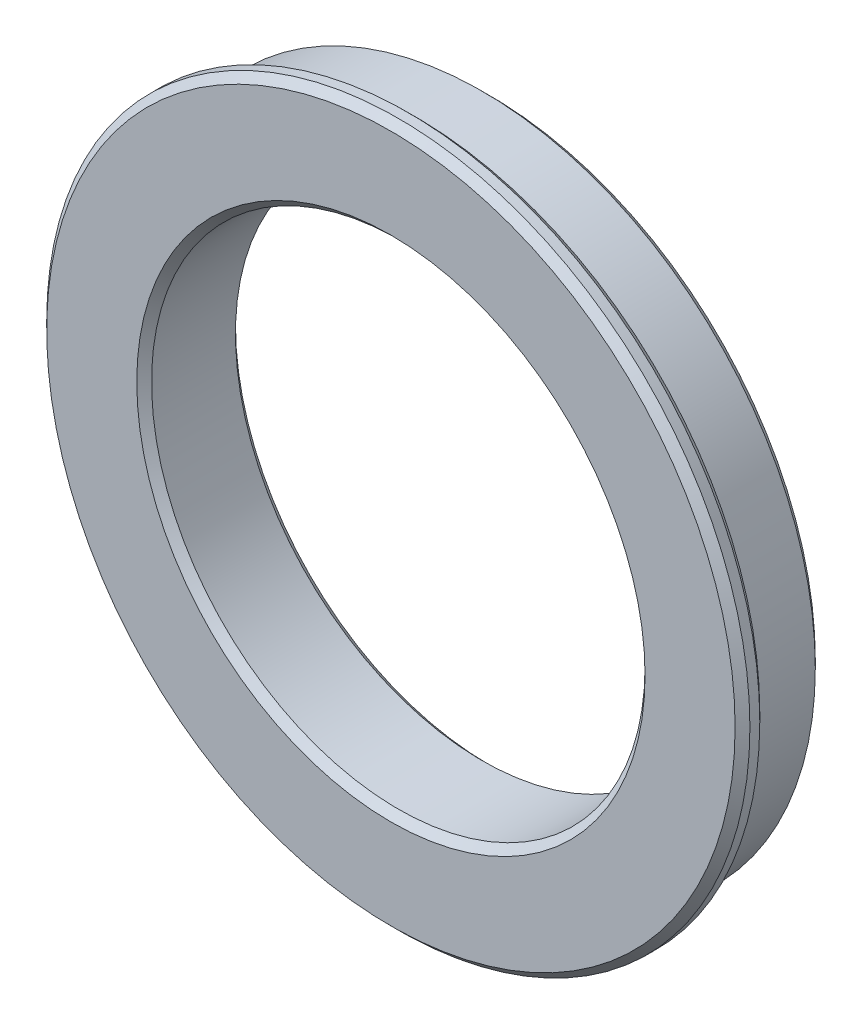
ISO-10303-21;
HEADER;
FILE_DESCRIPTION(('STEP AP214'),'2;1');
FILE_NAME('part.step','',(''),(''),'','','');
FILE_SCHEMA(('AUTOMOTIVE_DESIGN { 1 0 10303 214 1 1 1 1 }'));
ENDSEC;
DATA;
#1=APPLICATION_CONTEXT('core data for automotive mechanical design processes');
#2=APPLICATION_PROTOCOL_DEFINITION('international standard','automotive_design',2000,#1);
#3=PRODUCT_CONTEXT('',#1,'mechanical');
#4=PRODUCT('Part','Part','',(#3));
#5=PRODUCT_RELATED_PRODUCT_CATEGORY('part','',(#4));
#6=PRODUCT_DEFINITION_FORMATION('','',#4);
#7=PRODUCT_DEFINITION_CONTEXT('part definition',#1,'design');
#8=PRODUCT_DEFINITION('design','',#6,#7);
#9=PRODUCT_DEFINITION_SHAPE('','',#8);
#10=(LENGTH_UNIT() NAMED_UNIT(*) SI_UNIT(.MILLI.,.METRE.));
#11=(NAMED_UNIT(*) PLANE_ANGLE_UNIT() SI_UNIT($,.RADIAN.));
#12=(NAMED_UNIT(*) SI_UNIT($,.STERADIAN.) SOLID_ANGLE_UNIT());
#13=UNCERTAINTY_MEASURE_WITH_UNIT(LENGTH_MEASURE(1.E-05),#10,'distance_accuracy_value','');
#14=(GEOMETRIC_REPRESENTATION_CONTEXT(3) GLOBAL_UNCERTAINTY_ASSIGNED_CONTEXT((#13)) GLOBAL_UNIT_ASSIGNED_CONTEXT((#10,
#11,#12)) REPRESENTATION_CONTEXT('',''));
#15=CARTESIAN_POINT('',(0.,0.,0.));
#16=DIRECTION('',(0.,0.,1.));
#17=DIRECTION('',(1.,0.,0.));
#18=AXIS2_PLACEMENT_3D('',#15,#16,#17);
#19=CARTESIAN_POINT('',(0.,0.,2.));
#20=DIRECTION('',(0.,0.,-1.));
#21=DIRECTION('',(-1.,0.,0.));
#22=AXIS2_PLACEMENT_3D('',#19,#20,#21);
#23=CYLINDRICAL_SURFACE('',#22,13.5);
#24=CARTESIAN_POINT('',(0.,0.,-1.7));
#25=DIRECTION('',(0.,0.,1.));
#26=DIRECTION('',(1.,0.,0.));
#27=AXIS2_PLACEMENT_3D('',#24,#25,#26);
#28=CIRCLE('',#27,13.5);
#29=CARTESIAN_POINT('',(13.5,0.,-1.7));
#30=VERTEX_POINT('',#29);
#31=EDGE_CURVE('E10',#30,#30,#28,.T.);
#32=ORIENTED_EDGE('',*,*,#31,.T.);
#33=EDGE_LOOP('',(#32));
#34=FACE_BOUND('',#33,.T.);
#35=CARTESIAN_POINT('',(0.,0.,1.));
#36=DIRECTION('',(0.,0.,1.));
#37=DIRECTION('',(1.,0.,0.));
#38=AXIS2_PLACEMENT_3D('',#35,#36,#37);
#39=CIRCLE('',#38,13.5);
#40=CARTESIAN_POINT('',(13.5,0.,1.));
#41=VERTEX_POINT('',#40);
#42=EDGE_CURVE('E72',#41,#41,#39,.T.);
#43=ORIENTED_EDGE('',*,*,#42,.F.);
#44=EDGE_LOOP('',(#43));
#45=FACE_BOUND('',#44,.T.);
#46=ADVANCED_FACE('F33',(#34,#45),#23,.T.);
#47=CARTESIAN_POINT('',(0.,0.,2.));
#48=DIRECTION('',(0.,0.,1.));
#49=DIRECTION('',(1.,0.,0.));
#50=AXIS2_PLACEMENT_3D('',#47,#48,#49);
#51=PLANE('',#50);
#52=CARTESIAN_POINT('',(0.,0.,2.));
#53=DIRECTION('',(0.,0.,1.));
#54=DIRECTION('',(1.,0.,0.));
#55=AXIS2_PLACEMENT_3D('',#52,#53,#54);
#56=CIRCLE('',#55,10.3);
#57=CARTESIAN_POINT('',(10.3,0.,2.));
#58=VERTEX_POINT('',#57);
#59=EDGE_CURVE('E60',#58,#58,#56,.F.);
#60=ORIENTED_EDGE('',*,*,#59,.T.);
#61=EDGE_LOOP('',(#60));
#62=FACE_BOUND('',#61,.T.);
#63=CARTESIAN_POINT('',(0.,0.,2.));
#64=DIRECTION('',(0.,0.,1.));
#65=DIRECTION('',(1.,0.,0.));
#66=AXIS2_PLACEMENT_3D('',#63,#64,#65);
#67=CIRCLE('',#66,13.95);
#68=CARTESIAN_POINT('',(13.95,0.,2.));
#69=VERTEX_POINT('',#68);
#70=EDGE_CURVE('E63',#69,#69,#67,.T.);
#71=ORIENTED_EDGE('',*,*,#70,.T.);
#72=EDGE_LOOP('',(#71));
#73=FACE_BOUND('',#72,.T.);
#74=ADVANCED_FACE('F79',(#62,#73),#51,.T.);
#75=CARTESIAN_POINT('',(0.,0.,-2.));
#76=DIRECTION('',(0.,0.,1.));
#77=DIRECTION('',(1.,0.,0.));
#78=AXIS2_PLACEMENT_3D('',#75,#76,#77);
#79=PLANE('',#78);
#80=CARTESIAN_POINT('',(0.,0.,-2.));
#81=DIRECTION('',(0.,0.,1.));
#82=DIRECTION('',(1.,0.,0.));
#83=AXIS2_PLACEMENT_3D('',#80,#81,#82);
#84=CIRCLE('',#83,10.3);
#85=CARTESIAN_POINT('',(10.3,0.,-2.));
#86=VERTEX_POINT('',#85);
#87=EDGE_CURVE('E41',#86,#86,#84,.T.);
#88=ORIENTED_EDGE('',*,*,#87,.T.);
#89=EDGE_LOOP('',(#88));
#90=FACE_BOUND('',#89,.T.);
#91=CARTESIAN_POINT('',(0.,0.,-2.));
#92=DIRECTION('',(0.,0.,1.));
#93=DIRECTION('',(1.,0.,0.));
#94=AXIS2_PLACEMENT_3D('',#91,#92,#93);
#95=CIRCLE('',#94,13.2);
#96=CARTESIAN_POINT('',(13.2,0.,-2.));
#97=VERTEX_POINT('',#96);
#98=EDGE_CURVE('E45',#97,#97,#95,.F.);
#99=ORIENTED_EDGE('',*,*,#98,.T.);
#100=EDGE_LOOP('',(#99));
#101=FACE_BOUND('',#100,.T.);
#102=ADVANCED_FACE('F84',(#90,#101),#79,.F.);
#103=CARTESIAN_POINT('',(0.,0.,2.));
#104=DIRECTION('',(0.,0.,-1.));
#105=DIRECTION('',(-1.,0.,0.));
#106=AXIS2_PLACEMENT_3D('',#103,#104,#105);
#107=CYLINDRICAL_SURFACE('',#106,10.);
#108=CARTESIAN_POINT('',(0.,0.,1.7));
#109=DIRECTION('',(0.,0.,1.));
#110=DIRECTION('',(1.,0.,0.));
#111=AXIS2_PLACEMENT_3D('',#108,#109,#110);
#112=CIRCLE('',#111,10.);
#113=CARTESIAN_POINT('',(10.,0.,1.7));
#114=VERTEX_POINT('',#113);
#115=EDGE_CURVE('E66',#114,#114,#112,.T.);
#116=ORIENTED_EDGE('',*,*,#115,.T.);
#117=EDGE_LOOP('',(#116));
#118=FACE_BOUND('',#117,.T.);
#119=CARTESIAN_POINT('',(0.,0.,-1.7));
#120=DIRECTION('',(0.,0.,1.));
#121=DIRECTION('',(1.,0.,0.));
#122=AXIS2_PLACEMENT_3D('',#119,#120,#121);
#123=CIRCLE('',#122,10.);
#124=CARTESIAN_POINT('',(10.,0.,-1.7));
#125=VERTEX_POINT('',#124);
#126=EDGE_CURVE('E69',#125,#125,#123,.F.);
#127=ORIENTED_EDGE('',*,*,#126,.T.);
#128=EDGE_LOOP('',(#127));
#129=FACE_BOUND('',#128,.T.);
#130=ADVANCED_FACE('F123',(#118,#129),#107,.F.);
#131=CARTESIAN_POINT('',(0.,0.,1.));
#132=DIRECTION('',(0.,0.,1.));
#133=DIRECTION('',(1.,0.,0.));
#134=AXIS2_PLACEMENT_3D('',#131,#132,#133);
#135=PLANE('',#134);
#136=CARTESIAN_POINT('',(0.,0.,1.));
#137=DIRECTION('',(0.,0.,1.));
#138=DIRECTION('',(1.,0.,0.));
#139=AXIS2_PLACEMENT_3D('',#136,#137,#138);
#140=CIRCLE('',#139,13.95);
#141=CARTESIAN_POINT('',(13.95,0.,1.));
#142=VERTEX_POINT('',#141);
#143=EDGE_CURVE('E49',#142,#142,#140,.F.);
#144=ORIENTED_EDGE('',*,*,#143,.T.);
#145=EDGE_LOOP('',(#144));
#146=FACE_BOUND('',#145,.T.);
#147=ORIENTED_EDGE('',*,*,#42,.T.);
#148=EDGE_LOOP('',(#147));
#149=FACE_BOUND('',#148,.T.);
#150=ADVANCED_FACE('F76',(#146,#149),#135,.F.);
#151=CARTESIAN_POINT('',(0.,0.,1.));
#152=DIRECTION('',(0.,0.,1.));
#153=DIRECTION('',(1.,0.,0.));
#154=AXIS2_PLACEMENT_3D('',#151,#152,#153);
#155=CYLINDRICAL_SURFACE('',#154,14.25);
#156=CARTESIAN_POINT('',(0.,0.,1.7));
#157=DIRECTION('',(0.,0.,1.));
#158=DIRECTION('',(1.,0.,0.));
#159=AXIS2_PLACEMENT_3D('',#156,#157,#158);
#160=CIRCLE('',#159,14.25);
#161=CARTESIAN_POINT('',(14.25,0.,1.7));
#162=VERTEX_POINT('',#161);
#163=EDGE_CURVE('E54',#162,#162,#160,.F.);
#164=ORIENTED_EDGE('',*,*,#163,.T.);
#165=EDGE_LOOP('',(#164));
#166=FACE_BOUND('',#165,.T.);
#167=CARTESIAN_POINT('',(0.,0.,1.3));
#168=DIRECTION('',(0.,0.,1.));
#169=DIRECTION('',(1.,0.,0.));
#170=AXIS2_PLACEMENT_3D('',#167,#168,#169);
#171=CIRCLE('',#170,14.25);
#172=CARTESIAN_POINT('',(14.25,0.,1.3));
#173=VERTEX_POINT('',#172);
#174=EDGE_CURVE('E57',#173,#173,#171,.T.);
#175=ORIENTED_EDGE('',*,*,#174,.T.);
#176=EDGE_LOOP('',(#175));
#177=FACE_BOUND('',#176,.T.);
#178=ADVANCED_FACE('F97',(#166,#177),#155,.T.);
#179=CARTESIAN_POINT('',(0.,0.,1.7));
#180=DIRECTION('',(0.,0.,1.));
#181=DIRECTION('',(1.,0.,0.));
#182=AXIS2_PLACEMENT_3D('',#179,#180,#181);
#183=CONICAL_SURFACE('',#182,10.,0.785398163397448);
#184=ORIENTED_EDGE('',*,*,#59,.F.);
#185=EDGE_LOOP('',(#184));
#186=FACE_BOUND('',#185,.T.);
#187=ORIENTED_EDGE('',*,*,#115,.F.);
#188=EDGE_LOOP('',(#187));
#189=FACE_BOUND('',#188,.T.);
#190=ADVANCED_FACE('F90',(#186,#189),#183,.F.);
#191=CARTESIAN_POINT('',(0.,0.,2.));
#192=DIRECTION('',(0.,0.,-1.));
#193=DIRECTION('',(-1.,0.,0.));
#194=AXIS2_PLACEMENT_3D('',#191,#192,#193);
#195=CONICAL_SURFACE('',#194,13.95,0.785398163397454);
#196=ORIENTED_EDGE('',*,*,#163,.F.);
#197=EDGE_LOOP('',(#196));
#198=FACE_BOUND('',#197,.T.);
#199=ORIENTED_EDGE('',*,*,#70,.F.);
#200=EDGE_LOOP('',(#199));
#201=FACE_BOUND('',#200,.T.);
#202=ADVANCED_FACE('F96',(#198,#201),#195,.T.);
#203=CARTESIAN_POINT('',(0.,0.,1.3));
#204=DIRECTION('',(0.,0.,1.));
#205=DIRECTION('',(1.,0.,0.));
#206=AXIS2_PLACEMENT_3D('',#203,#204,#205);
#207=CONICAL_SURFACE('',#206,14.25,0.785398163397445);
#208=ORIENTED_EDGE('',*,*,#143,.F.);
#209=EDGE_LOOP('',(#208));
#210=FACE_BOUND('',#209,.T.);
#211=ORIENTED_EDGE('',*,*,#174,.F.);
#212=EDGE_LOOP('',(#211));
#213=FACE_BOUND('',#212,.T.);
#214=ADVANCED_FACE('F104',(#210,#213),#207,.T.);
#215=CARTESIAN_POINT('',(0.,0.,-2.));
#216=DIRECTION('',(0.,0.,-1.));
#217=DIRECTION('',(-1.,0.,0.));
#218=AXIS2_PLACEMENT_3D('',#215,#216,#217);
#219=CONICAL_SURFACE('',#218,10.3,0.785398163397445);
#220=ORIENTED_EDGE('',*,*,#126,.F.);
#221=EDGE_LOOP('',(#220));
#222=FACE_BOUND('',#221,.T.);
#223=ORIENTED_EDGE('',*,*,#87,.F.);
#224=EDGE_LOOP('',(#223));
#225=FACE_BOUND('',#224,.T.);
#226=ADVANCED_FACE('F110',(#222,#225),#219,.F.);
#227=CARTESIAN_POINT('',(0.,0.,-1.7));
#228=DIRECTION('',(0.,0.,1.));
#229=DIRECTION('',(1.,0.,0.));
#230=AXIS2_PLACEMENT_3D('',#227,#228,#229);
#231=CONICAL_SURFACE('',#230,13.5,0.785398163397448);
#232=ORIENTED_EDGE('',*,*,#98,.F.);
#233=EDGE_LOOP('',(#232));
#234=FACE_BOUND('',#233,.T.);
#235=ORIENTED_EDGE('',*,*,#31,.F.);
#236=EDGE_LOOP('',(#235));
#237=FACE_BOUND('',#236,.T.);
#238=ADVANCED_FACE('F36',(#234,#237),#231,.T.);
#239=CLOSED_SHELL('',(#46,#74,#102,#130,#150,#178,#190,#202,#214,#226,#238));
#240=MANIFOLD_SOLID_BREP('B2',#239);
#241=ADVANCED_BREP_SHAPE_REPRESENTATION('',(#18,#240),#14);
#242=SHAPE_DEFINITION_REPRESENTATION(#9,#241);
ENDSEC;
END-ISO-10303-21;
